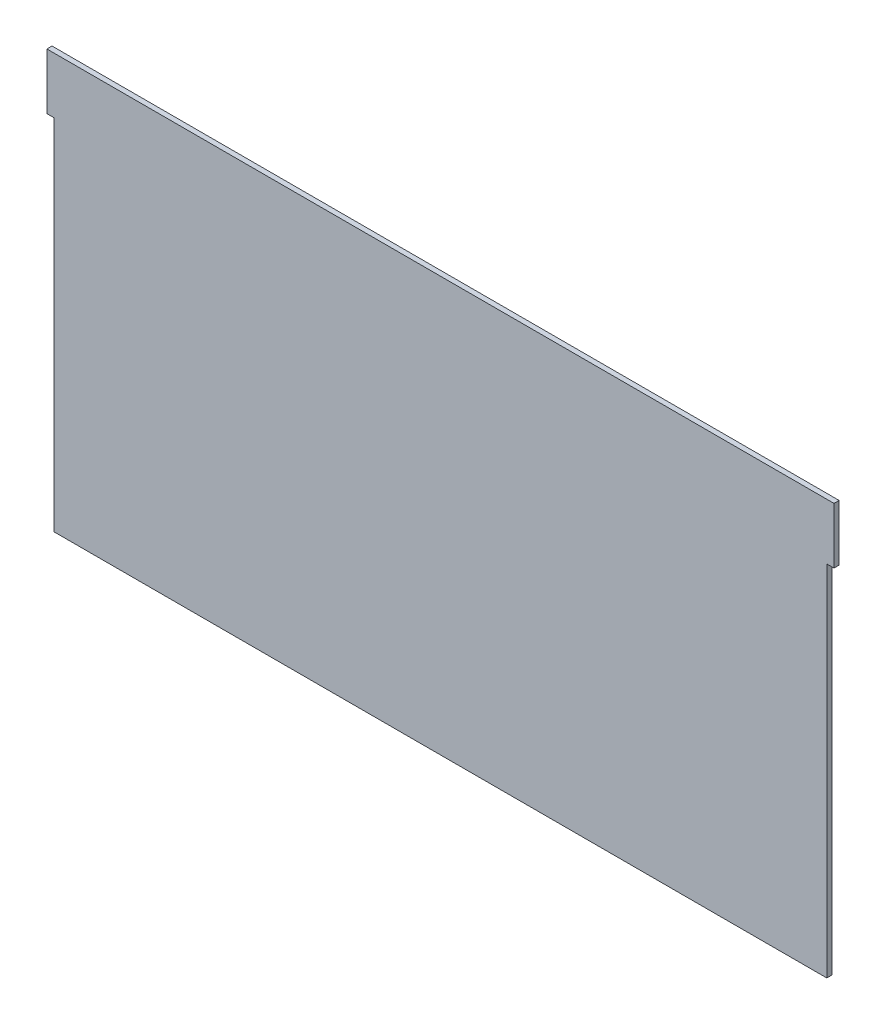
ISO-10303-21;
HEADER;
FILE_DESCRIPTION(('STEP AP214'),'2;1');
FILE_NAME('part.step','',(''),(''),'','','');
FILE_SCHEMA(('AUTOMOTIVE_DESIGN { 1 0 10303 214 1 1 1 1 }'));
ENDSEC;
DATA;
#1=APPLICATION_CONTEXT('core data for automotive mechanical design processes');
#2=APPLICATION_PROTOCOL_DEFINITION('international standard','automotive_design',2000,#1);
#3=PRODUCT_CONTEXT('',#1,'mechanical');
#4=PRODUCT('Part','Part','',(#3));
#5=PRODUCT_RELATED_PRODUCT_CATEGORY('part','',(#4));
#6=PRODUCT_DEFINITION_FORMATION('','',#4);
#7=PRODUCT_DEFINITION_CONTEXT('part definition',#1,'design');
#8=PRODUCT_DEFINITION('design','',#6,#7);
#9=PRODUCT_DEFINITION_SHAPE('','',#8);
#10=(LENGTH_UNIT() NAMED_UNIT(*) SI_UNIT(.MILLI.,.METRE.));
#11=(NAMED_UNIT(*) PLANE_ANGLE_UNIT() SI_UNIT($,.RADIAN.));
#12=(NAMED_UNIT(*) SI_UNIT($,.STERADIAN.) SOLID_ANGLE_UNIT());
#13=UNCERTAINTY_MEASURE_WITH_UNIT(LENGTH_MEASURE(1.E-05),#10,'distance_accuracy_value','');
#14=(GEOMETRIC_REPRESENTATION_CONTEXT(3) GLOBAL_UNCERTAINTY_ASSIGNED_CONTEXT((#13)) GLOBAL_UNIT_ASSIGNED_CONTEXT((#10,
#11,#12)) REPRESENTATION_CONTEXT('',''));
#15=CARTESIAN_POINT('',(0.,0.,0.));
#16=DIRECTION('',(0.,0.,1.));
#17=DIRECTION('',(1.,0.,0.));
#18=AXIS2_PLACEMENT_3D('',#15,#16,#17);
#19=CARTESIAN_POINT('',(175.590172695,-92.4999995,2.286));
#20=DIRECTION('',(-1.,0.,0.));
#21=DIRECTION('',(0.,0.,1.));
#22=AXIS2_PLACEMENT_3D('',#19,#20,#21);
#23=PLANE('',#22);
#24=DIRECTION('',(0.,1.,0.));
#25=VECTOR('',#24,1.);
#26=CARTESIAN_POINT('',(175.590172695,-92.4999995,2.286));
#27=LINE('',#26,#25);
#28=CARTESIAN_POINT('',(175.590172695,67.5000005000001,2.286));
#29=VERTEX_POINT('',#28);
#30=CARTESIAN_POINT('',(175.590172695,92.4999995,2.286));
#31=VERTEX_POINT('',#30);
#32=EDGE_CURVE('E134',#29,#31,#27,.T.);
#33=ORIENTED_EDGE('',*,*,#32,.F.);
#34=DIRECTION('',(0.,0.,1.));
#35=VECTOR('',#34,1.);
#36=CARTESIAN_POINT('',(175.590172695,67.5000005000001,0.));
#37=LINE('',#36,#35);
#38=CARTESIAN_POINT('',(175.590172695,67.5000005000001,0.));
#39=VERTEX_POINT('',#38);
#40=EDGE_CURVE('E187',#39,#29,#37,.T.);
#41=ORIENTED_EDGE('',*,*,#40,.F.);
#42=DIRECTION('',(0.,1.,0.));
#43=VECTOR('',#42,1.);
#44=CARTESIAN_POINT('',(175.590172695,-92.4999995,0.));
#45=LINE('',#44,#43);
#46=CARTESIAN_POINT('',(175.590172695,92.4999995,0.));
#47=VERTEX_POINT('',#46);
#48=EDGE_CURVE('E161',#39,#47,#45,.T.);
#49=ORIENTED_EDGE('',*,*,#48,.T.);
#50=DIRECTION('',(0.,0.,-1.));
#51=VECTOR('',#50,1.);
#52=CARTESIAN_POINT('',(175.590172695,92.4999995,2.286));
#53=LINE('',#52,#51);
#54=EDGE_CURVE('E11',#31,#47,#53,.T.);
#55=ORIENTED_EDGE('',*,*,#54,.F.);
#56=EDGE_LOOP('',(#33,#41,#49,#55));
#57=FACE_BOUND('',#56,.T.);
#58=ADVANCED_FACE('F45',(#57),#23,.F.);
#59=CARTESIAN_POINT('',(-175.590172695,92.4999995,2.286));
#60=DIRECTION('',(0.,-1.,0.));
#61=DIRECTION('',(0.,0.,-1.));
#62=AXIS2_PLACEMENT_3D('',#59,#60,#61);
#63=PLANE('',#62);
#64=DIRECTION('',(-1.,0.,0.));
#65=VECTOR('',#64,1.);
#66=CARTESIAN_POINT('',(-175.590172695,92.4999995,0.));
#67=LINE('',#66,#65);
#68=CARTESIAN_POINT('',(-175.590172695,92.4999995,0.));
#69=VERTEX_POINT('',#68);
#70=EDGE_CURVE('E142',#47,#69,#67,.T.);
#71=ORIENTED_EDGE('',*,*,#70,.T.);
#72=DIRECTION('',(0.,0.,-1.));
#73=VECTOR('',#72,1.);
#74=CARTESIAN_POINT('',(-175.590172695,92.4999995,2.286));
#75=LINE('',#74,#73);
#76=CARTESIAN_POINT('',(-175.590172695,92.4999995,2.286));
#77=VERTEX_POINT('',#76);
#78=EDGE_CURVE('E53',#77,#69,#75,.T.);
#79=ORIENTED_EDGE('',*,*,#78,.F.);
#80=DIRECTION('',(-1.,0.,0.));
#81=VECTOR('',#80,1.);
#82=CARTESIAN_POINT('',(-175.590172695,92.4999995,2.286));
#83=LINE('',#82,#81);
#84=EDGE_CURVE('E139',#31,#77,#83,.T.);
#85=ORIENTED_EDGE('',*,*,#84,.F.);
#86=ORIENTED_EDGE('',*,*,#54,.T.);
#87=EDGE_LOOP('',(#71,#79,#85,#86));
#88=FACE_BOUND('',#87,.T.);
#89=ADVANCED_FACE('F167',(#88),#63,.F.);
#90=CARTESIAN_POINT('',(-175.590172695,-92.4999995,2.286));
#91=DIRECTION('',(1.,0.,0.));
#92=DIRECTION('',(0.,0.,-1.));
#93=AXIS2_PLACEMENT_3D('',#90,#91,#92);
#94=PLANE('',#93);
#95=DIRECTION('',(0.,-1.,0.));
#96=VECTOR('',#95,1.);
#97=CARTESIAN_POINT('',(-175.590172695,-92.4999995,0.));
#98=LINE('',#97,#96);
#99=CARTESIAN_POINT('',(-175.590172695,67.5000005,0.));
#100=VERTEX_POINT('',#99);
#101=EDGE_CURVE('E135',#69,#100,#98,.T.);
#102=ORIENTED_EDGE('',*,*,#101,.T.);
#103=DIRECTION('',(0.,0.,1.));
#104=VECTOR('',#103,1.);
#105=CARTESIAN_POINT('',(-175.590172695,67.5000005,0.));
#106=LINE('',#105,#104);
#107=CARTESIAN_POINT('',(-175.590172695,67.5000005,2.286));
#108=VERTEX_POINT('',#107);
#109=EDGE_CURVE('E163',#100,#108,#106,.T.);
#110=ORIENTED_EDGE('',*,*,#109,.T.);
#111=DIRECTION('',(0.,-1.,0.));
#112=VECTOR('',#111,1.);
#113=CARTESIAN_POINT('',(-175.590172695,-92.4999995,2.286));
#114=LINE('',#113,#112);
#115=EDGE_CURVE('E152',#77,#108,#114,.T.);
#116=ORIENTED_EDGE('',*,*,#115,.F.);
#117=ORIENTED_EDGE('',*,*,#78,.T.);
#118=EDGE_LOOP('',(#102,#110,#116,#117));
#119=FACE_BOUND('',#118,.T.);
#120=ADVANCED_FACE('F172',(#119),#94,.F.);
#121=CARTESIAN_POINT('',(-175.590172695,-92.4999995,2.286));
#122=DIRECTION('',(0.,1.,0.));
#123=DIRECTION('',(0.,0.,1.));
#124=AXIS2_PLACEMENT_3D('',#121,#122,#123);
#125=PLANE('',#124);
#126=DIRECTION('',(1.,0.,0.));
#127=VECTOR('',#126,1.);
#128=CARTESIAN_POINT('',(-175.590172695,-92.4999995,2.286));
#129=LINE('',#128,#127);
#130=CARTESIAN_POINT('',(-172.390172695,-92.4999995,2.286));
#131=VERTEX_POINT('',#130);
#132=CARTESIAN_POINT('',(172.390172695,-92.4999994999999,2.286));
#133=VERTEX_POINT('',#132);
#134=EDGE_CURVE('E128',#131,#133,#129,.T.);
#135=ORIENTED_EDGE('',*,*,#134,.F.);
#136=DIRECTION('',(0.,0.,1.));
#137=VECTOR('',#136,1.);
#138=CARTESIAN_POINT('',(-172.390172695,-92.4999995,0.));
#139=LINE('',#138,#137);
#140=CARTESIAN_POINT('',(-172.390172695,-92.4999995,0.));
#141=VERTEX_POINT('',#140);
#142=EDGE_CURVE('E113',#141,#131,#139,.T.);
#143=ORIENTED_EDGE('',*,*,#142,.F.);
#144=DIRECTION('',(1.,0.,0.));
#145=VECTOR('',#144,1.);
#146=CARTESIAN_POINT('',(-175.590172695,-92.4999995,0.));
#147=LINE('',#146,#145);
#148=CARTESIAN_POINT('',(172.390172695,-92.4999994999999,0.));
#149=VERTEX_POINT('',#148);
#150=EDGE_CURVE('E126',#141,#149,#147,.T.);
#151=ORIENTED_EDGE('',*,*,#150,.T.);
#152=DIRECTION('',(0.,0.,1.));
#153=VECTOR('',#152,1.);
#154=CARTESIAN_POINT('',(172.390172695,-92.4999994999999,0.));
#155=LINE('',#154,#153);
#156=EDGE_CURVE('E195',#149,#133,#155,.T.);
#157=ORIENTED_EDGE('',*,*,#156,.T.);
#158=EDGE_LOOP('',(#135,#143,#151,#157));
#159=FACE_BOUND('',#158,.T.);
#160=ADVANCED_FACE('F124',(#159),#125,.F.);
#161=CARTESIAN_POINT('',(0.,0.,2.286));
#162=DIRECTION('',(0.,0.,-1.));
#163=DIRECTION('',(-1.,0.,0.));
#164=AXIS2_PLACEMENT_3D('',#161,#162,#163);
#165=PLANE('',#164);
#166=ORIENTED_EDGE('',*,*,#115,.T.);
#167=DIRECTION('',(-1.,0.,0.));
#168=VECTOR('',#167,1.);
#169=CARTESIAN_POINT('',(-175.590172695,67.5000005,2.286));
#170=LINE('',#169,#168);
#171=CARTESIAN_POINT('',(-172.390172695,67.5000005,2.286));
#172=VERTEX_POINT('',#171);
#173=EDGE_CURVE('E119',#172,#108,#170,.T.);
#174=ORIENTED_EDGE('',*,*,#173,.F.);
#175=DIRECTION('',(0.,1.,0.));
#176=VECTOR('',#175,1.);
#177=CARTESIAN_POINT('',(-172.390172695,-92.4999995,2.286));
#178=LINE('',#177,#176);
#179=EDGE_CURVE('E192',#131,#172,#178,.T.);
#180=ORIENTED_EDGE('',*,*,#179,.F.);
#181=ORIENTED_EDGE('',*,*,#134,.T.);
#182=DIRECTION('',(0.,-1.,0.));
#183=VECTOR('',#182,1.);
#184=CARTESIAN_POINT('',(172.390172695,-92.4999994999999,2.286));
#185=LINE('',#184,#183);
#186=CARTESIAN_POINT('',(172.390172695,67.5000005000001,2.286));
#187=VERTEX_POINT('',#186);
#188=EDGE_CURVE('E184',#187,#133,#185,.T.);
#189=ORIENTED_EDGE('',*,*,#188,.F.);
#190=DIRECTION('',(-1.,0.,0.));
#191=VECTOR('',#190,1.);
#192=CARTESIAN_POINT('',(175.590172695,67.5000005000001,2.286));
#193=LINE('',#192,#191);
#194=EDGE_CURVE('E188',#29,#187,#193,.T.);
#195=ORIENTED_EDGE('',*,*,#194,.F.);
#196=ORIENTED_EDGE('',*,*,#32,.T.);
#197=ORIENTED_EDGE('',*,*,#84,.T.);
#198=EDGE_LOOP('',(#166,#174,#180,#181,#189,#195,#196,#197));
#199=FACE_BOUND('',#198,.T.);
#200=ADVANCED_FACE('F176',(#199),#165,.F.);
#201=CARTESIAN_POINT('',(0.,0.,0.));
#202=DIRECTION('',(0.,0.,-1.));
#203=DIRECTION('',(-1.,0.,0.));
#204=AXIS2_PLACEMENT_3D('',#201,#202,#203);
#205=PLANE('',#204);
#206=DIRECTION('',(-1.,0.,0.));
#207=VECTOR('',#206,1.);
#208=CARTESIAN_POINT('',(-175.590172695,67.5000005,0.));
#209=LINE('',#208,#207);
#210=CARTESIAN_POINT('',(-172.390172695,67.5000005,0.));
#211=VERTEX_POINT('',#210);
#212=EDGE_CURVE('E60',#211,#100,#209,.T.);
#213=ORIENTED_EDGE('',*,*,#212,.T.);
#214=ORIENTED_EDGE('',*,*,#101,.F.);
#215=ORIENTED_EDGE('',*,*,#70,.F.);
#216=ORIENTED_EDGE('',*,*,#48,.F.);
#217=DIRECTION('',(-1.,0.,0.));
#218=VECTOR('',#217,1.);
#219=CARTESIAN_POINT('',(175.590172695,67.5000005000001,0.));
#220=LINE('',#219,#218);
#221=CARTESIAN_POINT('',(172.390172695,67.5000005000001,0.));
#222=VERTEX_POINT('',#221);
#223=EDGE_CURVE('E181',#39,#222,#220,.T.);
#224=ORIENTED_EDGE('',*,*,#223,.T.);
#225=DIRECTION('',(0.,-1.,0.));
#226=VECTOR('',#225,1.);
#227=CARTESIAN_POINT('',(172.390172695,-92.4999994999999,0.));
#228=LINE('',#227,#226);
#229=EDGE_CURVE('E68',#222,#149,#228,.T.);
#230=ORIENTED_EDGE('',*,*,#229,.T.);
#231=ORIENTED_EDGE('',*,*,#150,.F.);
#232=DIRECTION('',(0.,1.,0.));
#233=VECTOR('',#232,1.);
#234=CARTESIAN_POINT('',(-172.390172695,-92.4999995,0.));
#235=LINE('',#234,#233);
#236=EDGE_CURVE('E109',#141,#211,#235,.T.);
#237=ORIENTED_EDGE('',*,*,#236,.T.);
#238=EDGE_LOOP('',(#213,#214,#215,#216,#224,#230,#231,#237));
#239=FACE_BOUND('',#238,.T.);
#240=ADVANCED_FACE('F131',(#239),#205,.T.);
#241=CARTESIAN_POINT('',(172.390172695,-92.4999994999999,0.));
#242=DIRECTION('',(-1.,0.,0.));
#243=DIRECTION('',(0.,-1.,0.));
#244=AXIS2_PLACEMENT_3D('',#241,#242,#243);
#245=PLANE('',#244);
#246=ORIENTED_EDGE('',*,*,#188,.T.);
#247=ORIENTED_EDGE('',*,*,#156,.F.);
#248=ORIENTED_EDGE('',*,*,#229,.F.);
#249=DIRECTION('',(0.,0.,1.));
#250=VECTOR('',#249,1.);
#251=CARTESIAN_POINT('',(172.390172695,67.5000005000001,0.));
#252=LINE('',#251,#250);
#253=EDGE_CURVE('E198',#222,#187,#252,.T.);
#254=ORIENTED_EDGE('',*,*,#253,.T.);
#255=EDGE_LOOP('',(#246,#247,#248,#254));
#256=FACE_BOUND('',#255,.T.);
#257=ADVANCED_FACE('F219',(#256),#245,.F.);
#258=CARTESIAN_POINT('',(175.590172695,67.5000005000001,0.));
#259=DIRECTION('',(0.,1.,0.));
#260=DIRECTION('',(0.,0.,1.));
#261=AXIS2_PLACEMENT_3D('',#258,#259,#260);
#262=PLANE('',#261);
#263=ORIENTED_EDGE('',*,*,#194,.T.);
#264=ORIENTED_EDGE('',*,*,#253,.F.);
#265=ORIENTED_EDGE('',*,*,#223,.F.);
#266=ORIENTED_EDGE('',*,*,#40,.T.);
#267=EDGE_LOOP('',(#263,#264,#265,#266));
#268=FACE_BOUND('',#267,.T.);
#269=ADVANCED_FACE('F212',(#268),#262,.F.);
#270=CARTESIAN_POINT('',(-175.590172695,67.5000005,0.));
#271=DIRECTION('',(0.,1.,0.));
#272=DIRECTION('',(0.,0.,1.));
#273=AXIS2_PLACEMENT_3D('',#270,#271,#272);
#274=PLANE('',#273);
#275=ORIENTED_EDGE('',*,*,#173,.T.);
#276=ORIENTED_EDGE('',*,*,#109,.F.);
#277=ORIENTED_EDGE('',*,*,#212,.F.);
#278=DIRECTION('',(0.,0.,1.));
#279=VECTOR('',#278,1.);
#280=CARTESIAN_POINT('',(-172.390172695,67.5000005,0.));
#281=LINE('',#280,#279);
#282=EDGE_CURVE('E115',#211,#172,#281,.T.);
#283=ORIENTED_EDGE('',*,*,#282,.T.);
#284=EDGE_LOOP('',(#275,#276,#277,#283));
#285=FACE_BOUND('',#284,.T.);
#286=ADVANCED_FACE('F210',(#285),#274,.F.);
#287=CARTESIAN_POINT('',(-172.390172695,-92.4999995,0.));
#288=DIRECTION('',(1.,0.,0.));
#289=DIRECTION('',(0.,0.,-1.));
#290=AXIS2_PLACEMENT_3D('',#287,#288,#289);
#291=PLANE('',#290);
#292=ORIENTED_EDGE('',*,*,#179,.T.);
#293=ORIENTED_EDGE('',*,*,#282,.F.);
#294=ORIENTED_EDGE('',*,*,#236,.F.);
#295=ORIENTED_EDGE('',*,*,#142,.T.);
#296=EDGE_LOOP('',(#292,#293,#294,#295));
#297=FACE_BOUND('',#296,.T.);
#298=ADVANCED_FACE('F112',(#297),#291,.F.);
#299=CLOSED_SHELL('',(#58,#89,#120,#160,#200,#240,#257,#269,#286,#298));
#300=MANIFOLD_SOLID_BREP('B2',#299);
#301=ADVANCED_BREP_SHAPE_REPRESENTATION('',(#18,#300),#14);
#302=SHAPE_DEFINITION_REPRESENTATION(#9,#301);
ENDSEC;
END-ISO-10303-21;
